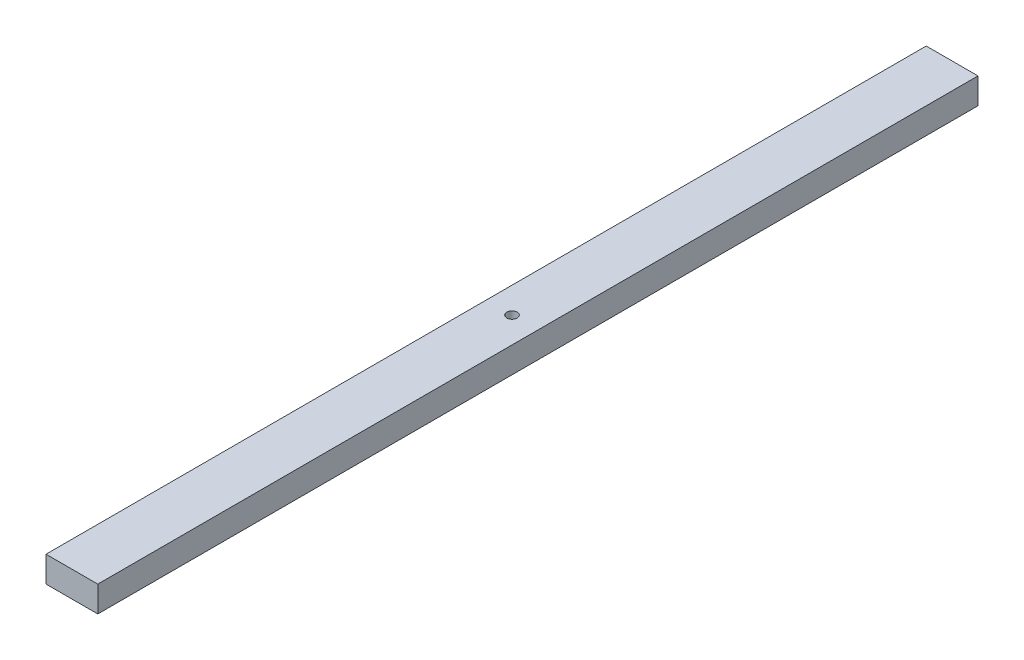
ISO-10303-21;
HEADER;
FILE_DESCRIPTION(('STEP AP214'),'2;1');
FILE_NAME('part.step','',(''),(''),'','','');
FILE_SCHEMA(('AUTOMOTIVE_DESIGN { 1 0 10303 214 1 1 1 1 }'));
ENDSEC;
DATA;
#1=APPLICATION_CONTEXT('core data for automotive mechanical design processes');
#2=APPLICATION_PROTOCOL_DEFINITION('international standard','automotive_design',2000,#1);
#3=PRODUCT_CONTEXT('',#1,'mechanical');
#4=PRODUCT('Part','Part','',(#3));
#5=PRODUCT_RELATED_PRODUCT_CATEGORY('part','',(#4));
#6=PRODUCT_DEFINITION_FORMATION('','',#4);
#7=PRODUCT_DEFINITION_CONTEXT('part definition',#1,'design');
#8=PRODUCT_DEFINITION('design','',#6,#7);
#9=PRODUCT_DEFINITION_SHAPE('','',#8);
#10=(LENGTH_UNIT() NAMED_UNIT(*) SI_UNIT(.MILLI.,.METRE.));
#11=(NAMED_UNIT(*) PLANE_ANGLE_UNIT() SI_UNIT($,.RADIAN.));
#12=(NAMED_UNIT(*) SI_UNIT($,.STERADIAN.) SOLID_ANGLE_UNIT());
#13=UNCERTAINTY_MEASURE_WITH_UNIT(LENGTH_MEASURE(1.E-05),#10,'distance_accuracy_value','');
#14=(GEOMETRIC_REPRESENTATION_CONTEXT(3) GLOBAL_UNCERTAINTY_ASSIGNED_CONTEXT((#13)) GLOBAL_UNIT_ASSIGNED_CONTEXT((#10,
#11,#12)) REPRESENTATION_CONTEXT('',''));
#15=CARTESIAN_POINT('',(0.,0.,0.));
#16=DIRECTION('',(0.,0.,1.));
#17=DIRECTION('',(1.,0.,0.));
#18=AXIS2_PLACEMENT_3D('',#15,#16,#17);
#19=CARTESIAN_POINT('',(0.,0.,1700.));
#20=DIRECTION('',(1.,0.,0.));
#21=DIRECTION('',(0.,0.,-1.));
#22=AXIS2_PLACEMENT_3D('',#19,#20,#21);
#23=PLANE('',#22);
#24=DIRECTION('',(0.,-1.,0.));
#25=VECTOR('',#24,1.);
#26=CARTESIAN_POINT('',(0.,0.,0.));
#27=LINE('',#26,#25);
#28=CARTESIAN_POINT('',(0.,50.,0.));
#29=VERTEX_POINT('',#28);
#30=CARTESIAN_POINT('',(0.,0.,0.));
#31=VERTEX_POINT('',#30);
#32=EDGE_CURVE('E96',#29,#31,#27,.T.);
#33=ORIENTED_EDGE('',*,*,#32,.T.);
#34=DIRECTION('',(0.,0.,-1.));
#35=VECTOR('',#34,1.);
#36=CARTESIAN_POINT('',(0.,0.,1700.));
#37=LINE('',#36,#35);
#38=CARTESIAN_POINT('',(0.,0.,1700.));
#39=VERTEX_POINT('',#38);
#40=EDGE_CURVE('E11',#39,#31,#37,.T.);
#41=ORIENTED_EDGE('',*,*,#40,.F.);
#42=DIRECTION('',(0.,-1.,0.));
#43=VECTOR('',#42,1.);
#44=CARTESIAN_POINT('',(0.,0.,1700.));
#45=LINE('',#44,#43);
#46=CARTESIAN_POINT('',(0.,50.,1700.));
#47=VERTEX_POINT('',#46);
#48=EDGE_CURVE('E84',#47,#39,#45,.T.);
#49=ORIENTED_EDGE('',*,*,#48,.F.);
#50=DIRECTION('',(0.,0.,-1.));
#51=VECTOR('',#50,1.);
#52=CARTESIAN_POINT('',(0.,50.,1700.));
#53=LINE('',#52,#51);
#54=EDGE_CURVE('E92',#47,#29,#53,.T.);
#55=ORIENTED_EDGE('',*,*,#54,.T.);
#56=EDGE_LOOP('',(#33,#41,#49,#55));
#57=FACE_BOUND('',#56,.T.);
#58=ADVANCED_FACE('F33',(#57),#23,.F.);
#59=CARTESIAN_POINT('',(0.,0.,1700.));
#60=DIRECTION('',(0.,1.,0.));
#61=DIRECTION('',(0.,0.,1.));
#62=AXIS2_PLACEMENT_3D('',#59,#60,#61);
#63=PLANE('',#62);
#64=CARTESIAN_POINT('',(50.,0.,850.));
#65=DIRECTION('',(0.,-1.,0.));
#66=DIRECTION('',(0.,0.,-1.));
#67=AXIS2_PLACEMENT_3D('',#64,#65,#66);
#68=CIRCLE('',#67,10.);
#69=CARTESIAN_POINT('',(50.,0.,840.));
#70=VERTEX_POINT('',#69);
#71=EDGE_CURVE('E110',#70,#70,#68,.T.);
#72=ORIENTED_EDGE('',*,*,#71,.F.);
#73=EDGE_LOOP('',(#72));
#74=FACE_BOUND('',#73,.T.);
#75=DIRECTION('',(1.,0.,0.));
#76=VECTOR('',#75,1.);
#77=CARTESIAN_POINT('',(0.,0.,0.));
#78=LINE('',#77,#76);
#79=CARTESIAN_POINT('',(100.,0.,0.));
#80=VERTEX_POINT('',#79);
#81=EDGE_CURVE('E88',#31,#80,#78,.T.);
#82=ORIENTED_EDGE('',*,*,#81,.T.);
#83=DIRECTION('',(0.,0.,-1.));
#84=VECTOR('',#83,1.);
#85=CARTESIAN_POINT('',(100.,0.,1700.));
#86=LINE('',#85,#84);
#87=CARTESIAN_POINT('',(100.,0.,1700.));
#88=VERTEX_POINT('',#87);
#89=EDGE_CURVE('E41',#88,#80,#86,.T.);
#90=ORIENTED_EDGE('',*,*,#89,.F.);
#91=DIRECTION('',(1.,0.,0.));
#92=VECTOR('',#91,1.);
#93=CARTESIAN_POINT('',(0.,0.,1700.));
#94=LINE('',#93,#92);
#95=EDGE_CURVE('E79',#39,#88,#94,.T.);
#96=ORIENTED_EDGE('',*,*,#95,.F.);
#97=ORIENTED_EDGE('',*,*,#40,.T.);
#98=EDGE_LOOP('',(#82,#90,#96,#97));
#99=FACE_BOUND('',#98,.T.);
#100=ADVANCED_FACE('F87',(#74,#99),#63,.F.);
#101=CARTESIAN_POINT('',(100.,0.,1700.));
#102=DIRECTION('',(-1.,0.,0.));
#103=DIRECTION('',(0.,0.,1.));
#104=AXIS2_PLACEMENT_3D('',#101,#102,#103);
#105=PLANE('',#104);
#106=DIRECTION('',(0.,1.,0.));
#107=VECTOR('',#106,1.);
#108=CARTESIAN_POINT('',(100.,0.,0.));
#109=LINE('',#108,#107);
#110=CARTESIAN_POINT('',(100.,50.,0.));
#111=VERTEX_POINT('',#110);
#112=EDGE_CURVE('E66',#80,#111,#109,.T.);
#113=ORIENTED_EDGE('',*,*,#112,.T.);
#114=DIRECTION('',(0.,0.,-1.));
#115=VECTOR('',#114,1.);
#116=CARTESIAN_POINT('',(100.,50.,1700.));
#117=LINE('',#116,#115);
#118=CARTESIAN_POINT('',(100.,50.,1700.));
#119=VERTEX_POINT('',#118);
#120=EDGE_CURVE('E89',#119,#111,#117,.T.);
#121=ORIENTED_EDGE('',*,*,#120,.F.);
#122=DIRECTION('',(0.,1.,0.));
#123=VECTOR('',#122,1.);
#124=CARTESIAN_POINT('',(100.,0.,1700.));
#125=LINE('',#124,#123);
#126=EDGE_CURVE('E82',#88,#119,#125,.T.);
#127=ORIENTED_EDGE('',*,*,#126,.F.);
#128=ORIENTED_EDGE('',*,*,#89,.T.);
#129=EDGE_LOOP('',(#113,#121,#127,#128));
#130=FACE_BOUND('',#129,.T.);
#131=ADVANCED_FACE('F90',(#130),#105,.F.);
#132=CARTESIAN_POINT('',(0.,50.,1700.));
#133=DIRECTION('',(0.,-1.,0.));
#134=DIRECTION('',(0.,0.,-1.));
#135=AXIS2_PLACEMENT_3D('',#132,#133,#134);
#136=PLANE('',#135);
#137=CARTESIAN_POINT('',(50.,50.,850.));
#138=DIRECTION('',(0.,-1.,0.));
#139=DIRECTION('',(0.,0.,-1.));
#140=AXIS2_PLACEMENT_3D('',#137,#138,#139);
#141=CIRCLE('',#140,10.);
#142=CARTESIAN_POINT('',(50.,50.,840.));
#143=VERTEX_POINT('',#142);
#144=EDGE_CURVE('E99',#143,#143,#141,.T.);
#145=ORIENTED_EDGE('',*,*,#144,.T.);
#146=EDGE_LOOP('',(#145));
#147=FACE_BOUND('',#146,.T.);
#148=DIRECTION('',(-1.,0.,0.));
#149=VECTOR('',#148,1.);
#150=CARTESIAN_POINT('',(0.,50.,0.));
#151=LINE('',#150,#149);
#152=EDGE_CURVE('E72',#111,#29,#151,.T.);
#153=ORIENTED_EDGE('',*,*,#152,.T.);
#154=ORIENTED_EDGE('',*,*,#54,.F.);
#155=DIRECTION('',(-1.,0.,0.));
#156=VECTOR('',#155,1.);
#157=CARTESIAN_POINT('',(0.,50.,1700.));
#158=LINE('',#157,#156);
#159=EDGE_CURVE('E49',#119,#47,#158,.T.);
#160=ORIENTED_EDGE('',*,*,#159,.F.);
#161=ORIENTED_EDGE('',*,*,#120,.T.);
#162=EDGE_LOOP('',(#153,#154,#160,#161));
#163=FACE_BOUND('',#162,.T.);
#164=ADVANCED_FACE('F104',(#147,#163),#136,.F.);
#165=CARTESIAN_POINT('',(0.,0.,1700.));
#166=DIRECTION('',(0.,0.,-1.));
#167=DIRECTION('',(-1.,0.,0.));
#168=AXIS2_PLACEMENT_3D('',#165,#166,#167);
#169=PLANE('',#168);
#170=ORIENTED_EDGE('',*,*,#48,.T.);
#171=ORIENTED_EDGE('',*,*,#95,.T.);
#172=ORIENTED_EDGE('',*,*,#126,.T.);
#173=ORIENTED_EDGE('',*,*,#159,.T.);
#174=EDGE_LOOP('',(#170,#171,#172,#173));
#175=FACE_BOUND('',#174,.T.);
#176=ADVANCED_FACE('F80',(#175),#169,.F.);
#177=CARTESIAN_POINT('',(0.,0.,0.));
#178=DIRECTION('',(0.,0.,-1.));
#179=DIRECTION('',(-1.,0.,0.));
#180=AXIS2_PLACEMENT_3D('',#177,#178,#179);
#181=PLANE('',#180);
#182=ORIENTED_EDGE('',*,*,#32,.F.);
#183=ORIENTED_EDGE('',*,*,#152,.F.);
#184=ORIENTED_EDGE('',*,*,#112,.F.);
#185=ORIENTED_EDGE('',*,*,#81,.F.);
#186=EDGE_LOOP('',(#182,#183,#184,#185));
#187=FACE_BOUND('',#186,.T.);
#188=ADVANCED_FACE('F107',(#187),#181,.T.);
#189=CARTESIAN_POINT('',(50.,50.,850.));
#190=DIRECTION('',(0.,-1.,0.));
#191=DIRECTION('',(0.,0.,-1.));
#192=AXIS2_PLACEMENT_3D('',#189,#190,#191);
#193=CYLINDRICAL_SURFACE('',#192,10.);
#194=ORIENTED_EDGE('',*,*,#144,.F.);
#195=EDGE_LOOP('',(#194));
#196=FACE_BOUND('',#195,.T.);
#197=ORIENTED_EDGE('',*,*,#71,.T.);
#198=EDGE_LOOP('',(#197));
#199=FACE_BOUND('',#198,.T.);
#200=ADVANCED_FACE('F117',(#196,#199),#193,.F.);
#201=CLOSED_SHELL('',(#58,#100,#131,#164,#176,#188,#200));
#202=MANIFOLD_SOLID_BREP('B2',#201);
#203=ADVANCED_BREP_SHAPE_REPRESENTATION('',(#18,#202),#14);
#204=SHAPE_DEFINITION_REPRESENTATION(#9,#203);
ENDSEC;
END-ISO-10303-21;
